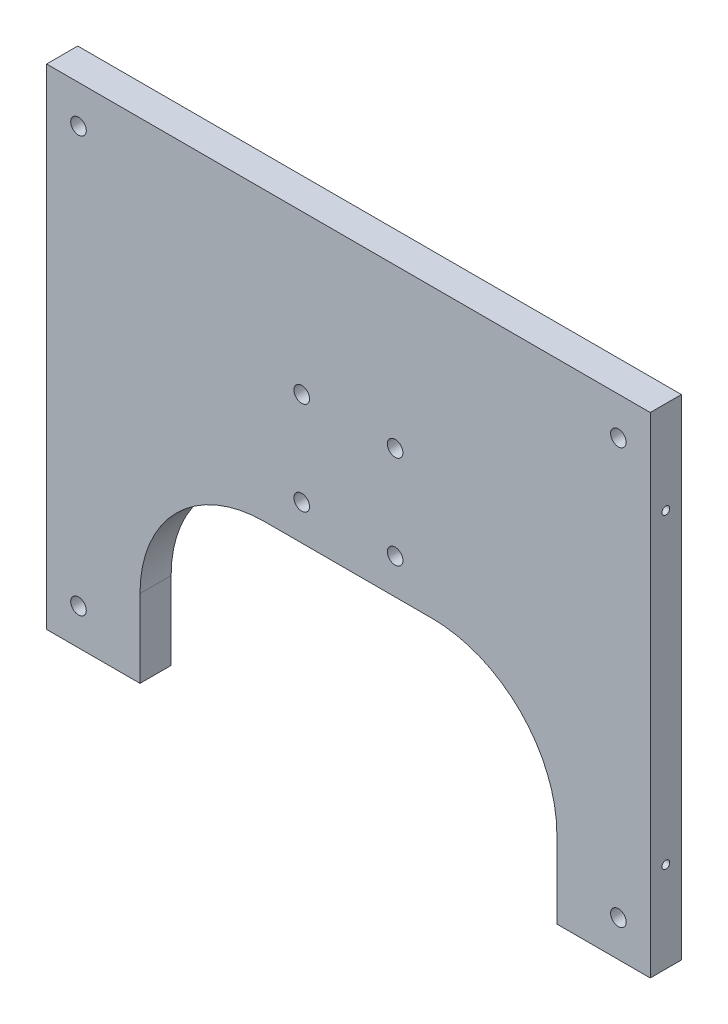
ISO-10303-21;
HEADER;
FILE_DESCRIPTION(('STEP AP214'),'2;1');
FILE_NAME('part.step','',(''),(''),'','','');
FILE_SCHEMA(('AUTOMOTIVE_DESIGN { 1 0 10303 214 1 1 1 1 }'));
ENDSEC;
DATA;
#1=APPLICATION_CONTEXT('core data for automotive mechanical design processes');
#2=APPLICATION_PROTOCOL_DEFINITION('international standard','automotive_design',2000,#1);
#3=PRODUCT_CONTEXT('',#1,'mechanical');
#4=PRODUCT('Part','Part','',(#3));
#5=PRODUCT_RELATED_PRODUCT_CATEGORY('part','',(#4));
#6=PRODUCT_DEFINITION_FORMATION('','',#4);
#7=PRODUCT_DEFINITION_CONTEXT('part definition',#1,'design');
#8=PRODUCT_DEFINITION('design','',#6,#7);
#9=PRODUCT_DEFINITION_SHAPE('','',#8);
#10=(LENGTH_UNIT() NAMED_UNIT(*) SI_UNIT(.MILLI.,.METRE.));
#11=(NAMED_UNIT(*) PLANE_ANGLE_UNIT() SI_UNIT($,.RADIAN.));
#12=(NAMED_UNIT(*) SI_UNIT($,.STERADIAN.) SOLID_ANGLE_UNIT());
#13=UNCERTAINTY_MEASURE_WITH_UNIT(LENGTH_MEASURE(1.E-05),#10,'distance_accuracy_value','');
#14=(GEOMETRIC_REPRESENTATION_CONTEXT(3) GLOBAL_UNCERTAINTY_ASSIGNED_CONTEXT((#13)) GLOBAL_UNIT_ASSIGNED_CONTEXT((#10,
#11,#12)) REPRESENTATION_CONTEXT('',''));
#15=CARTESIAN_POINT('',(0.,0.,0.));
#16=DIRECTION('',(0.,0.,1.));
#17=DIRECTION('',(1.,0.,0.));
#18=AXIS2_PLACEMENT_3D('',#15,#16,#17);
#19=CARTESIAN_POINT('',(12.6999999999998,10.7138543348663,-12.7));
#20=DIRECTION('',(-1.,0.,0.));
#21=DIRECTION('',(0.,-1.,0.));
#22=AXIS2_PLACEMENT_3D('',#19,#20,#21);
#23=PLANE('',#22);
#24=CARTESIAN_POINT('',(12.6999999999998,-152.193459622709,-6.34999999993047));
#25=DIRECTION('',(-1.,0.,0.));
#26=DIRECTION('',(0.,-1.,0.));
#27=AXIS2_PLACEMENT_3D('',#24,#25,#26);
#28=CIRCLE('',#27,1.58749999999999);
#29=CARTESIAN_POINT('',(12.6999999999998,-153.780959622709,-6.34999999993047));
#30=VERTEX_POINT('',#29);
#31=EDGE_CURVE('E178',#30,#30,#28,.T.);
#32=ORIENTED_EDGE('',*,*,#31,.F.);
#33=EDGE_LOOP('',(#32));
#34=FACE_BOUND('',#33,.T.);
#35=CARTESIAN_POINT('',(12.6999999999998,-27.0849452394577,-6.34999999993047));
#36=DIRECTION('',(-1.,0.,0.));
#37=DIRECTION('',(0.,-1.,0.));
#38=AXIS2_PLACEMENT_3D('',#35,#36,#37);
#39=CIRCLE('',#38,1.5875);
#40=CARTESIAN_POINT('',(12.6999999999998,-28.6724452394577,-6.34999999993047));
#41=VERTEX_POINT('',#40);
#42=EDGE_CURVE('E183',#41,#41,#39,.T.);
#43=ORIENTED_EDGE('',*,*,#42,.F.);
#44=EDGE_LOOP('',(#43));
#45=FACE_BOUND('',#44,.T.);
#46=DIRECTION('',(0.,-1.,0.));
#47=VECTOR('',#46,1.);
#48=CARTESIAN_POINT('',(12.6999999999998,10.7138543348663,0.));
#49=LINE('',#48,#47);
#50=CARTESIAN_POINT('',(12.6999999999998,10.7138543348663,0.));
#51=VERTEX_POINT('',#50);
#52=CARTESIAN_POINT('',(12.6999999999998,-189.051843155405,0.));
#53=VERTEX_POINT('',#52);
#54=EDGE_CURVE('E248',#51,#53,#49,.T.);
#55=ORIENTED_EDGE('',*,*,#54,.F.);
#56=DIRECTION('',(0.,0.,1.));
#57=VECTOR('',#56,1.);
#58=CARTESIAN_POINT('',(12.6999999999998,10.7138543348663,-12.7));
#59=LINE('',#58,#57);
#60=CARTESIAN_POINT('',(12.6999999999998,10.7138543348663,-12.7));
#61=VERTEX_POINT('',#60);
#62=EDGE_CURVE('E308',#61,#51,#59,.T.);
#63=ORIENTED_EDGE('',*,*,#62,.F.);
#64=DIRECTION('',(0.,-1.,0.));
#65=VECTOR('',#64,1.);
#66=CARTESIAN_POINT('',(12.6999999999998,10.7138543348663,-12.7));
#67=LINE('',#66,#65);
#68=CARTESIAN_POINT('',(12.6999999999998,-189.051843155405,-12.7));
#69=VERTEX_POINT('',#68);
#70=EDGE_CURVE('E249',#61,#69,#67,.T.);
#71=ORIENTED_EDGE('',*,*,#70,.T.);
#72=DIRECTION('',(0.,0.,1.));
#73=VECTOR('',#72,1.);
#74=CARTESIAN_POINT('',(12.6999999999998,-189.051843155405,-12.7));
#75=LINE('',#74,#73);
#76=EDGE_CURVE('E279',#69,#53,#75,.T.);
#77=ORIENTED_EDGE('',*,*,#76,.T.);
#78=EDGE_LOOP('',(#55,#63,#71,#77));
#79=FACE_BOUND('',#78,.T.);
#80=ADVANCED_FACE('F40',(#34,#45,#79),#23,.T.);
#81=CARTESIAN_POINT('',(258.933482757394,10.7138543348655,-12.7));
#82=DIRECTION('',(0.,1.,0.));
#83=DIRECTION('',(-1.,0.,0.));
#84=AXIS2_PLACEMENT_3D('',#81,#82,#83);
#85=PLANE('',#84);
#86=DIRECTION('',(-1.,0.,0.));
#87=VECTOR('',#86,1.);
#88=CARTESIAN_POINT('',(258.933482757394,10.7138543348655,0.));
#89=LINE('',#88,#87);
#90=CARTESIAN_POINT('',(258.933482757394,10.7138543348655,0.));
#91=VERTEX_POINT('',#90);
#92=EDGE_CURVE('E254',#91,#51,#89,.T.);
#93=ORIENTED_EDGE('',*,*,#92,.F.);
#94=DIRECTION('',(0.,0.,1.));
#95=VECTOR('',#94,1.);
#96=CARTESIAN_POINT('',(258.933482757394,10.7138543348655,-12.7));
#97=LINE('',#96,#95);
#98=CARTESIAN_POINT('',(258.933482757394,10.7138543348655,-12.7));
#99=VERTEX_POINT('',#98);
#100=EDGE_CURVE('E312',#99,#91,#97,.T.);
#101=ORIENTED_EDGE('',*,*,#100,.F.);
#102=DIRECTION('',(-1.,0.,0.));
#103=VECTOR('',#102,1.);
#104=CARTESIAN_POINT('',(258.933482757394,10.7138543348655,-12.7));
#105=LINE('',#104,#103);
#106=EDGE_CURVE('E275',#99,#61,#105,.T.);
#107=ORIENTED_EDGE('',*,*,#106,.T.);
#108=ORIENTED_EDGE('',*,*,#62,.T.);
#109=EDGE_LOOP('',(#93,#101,#107,#108));
#110=FACE_BOUND('',#109,.T.);
#111=ADVANCED_FACE('F361',(#110),#85,.T.);
#112=CARTESIAN_POINT('',(258.933482757394,10.7138543348655,-12.7));
#113=DIRECTION('',(1.,0.,0.));
#114=DIRECTION('',(0.,1.,0.));
#115=AXIS2_PLACEMENT_3D('',#112,#113,#114);
#116=PLANE('',#115);
#117=CARTESIAN_POINT('',(258.933482757393,-152.19345962271,-6.34999999993047));
#118=DIRECTION('',(1.,0.,0.));
#119=DIRECTION('',(0.,1.,0.));
#120=AXIS2_PLACEMENT_3D('',#117,#118,#119);
#121=CIRCLE('',#120,1.58749999999999);
#122=CARTESIAN_POINT('',(258.933482757393,-150.60595962271,-6.34999999993047));
#123=VERTEX_POINT('',#122);
#124=EDGE_CURVE('E44',#123,#123,#121,.T.);
#125=ORIENTED_EDGE('',*,*,#124,.F.);
#126=EDGE_LOOP('',(#125));
#127=FACE_BOUND('',#126,.T.);
#128=CARTESIAN_POINT('',(258.933482757394,-27.0849452394586,-6.34999999993047));
#129=DIRECTION('',(1.,0.,0.));
#130=DIRECTION('',(0.,1.,0.));
#131=AXIS2_PLACEMENT_3D('',#128,#129,#130);
#132=CIRCLE('',#131,1.5875);
#133=CARTESIAN_POINT('',(258.933482757394,-25.4974452394586,-6.34999999993047));
#134=VERTEX_POINT('',#133);
#135=EDGE_CURVE('E173',#134,#134,#132,.T.);
#136=ORIENTED_EDGE('',*,*,#135,.F.);
#137=EDGE_LOOP('',(#136));
#138=FACE_BOUND('',#137,.T.);
#139=DIRECTION('',(0.,1.,0.));
#140=VECTOR('',#139,1.);
#141=CARTESIAN_POINT('',(258.933482757394,10.7138543348655,0.));
#142=LINE('',#141,#140);
#143=CARTESIAN_POINT('',(258.933482757393,-189.051843155405,0.));
#144=VERTEX_POINT('',#143);
#145=EDGE_CURVE('E301',#144,#91,#142,.T.);
#146=ORIENTED_EDGE('',*,*,#145,.F.);
#147=DIRECTION('',(0.,0.,1.));
#148=VECTOR('',#147,1.);
#149=CARTESIAN_POINT('',(258.933482757393,-189.051843155405,-12.7));
#150=LINE('',#149,#148);
#151=CARTESIAN_POINT('',(258.933482757393,-189.051843155405,-12.7));
#152=VERTEX_POINT('',#151);
#153=EDGE_CURVE('E315',#152,#144,#150,.T.);
#154=ORIENTED_EDGE('',*,*,#153,.F.);
#155=DIRECTION('',(0.,1.,0.));
#156=VECTOR('',#155,1.);
#157=CARTESIAN_POINT('',(258.933482757394,10.7138543348655,-12.7));
#158=LINE('',#157,#156);
#159=EDGE_CURVE('E271',#152,#99,#158,.T.);
#160=ORIENTED_EDGE('',*,*,#159,.T.);
#161=ORIENTED_EDGE('',*,*,#100,.T.);
#162=EDGE_LOOP('',(#146,#154,#160,#161));
#163=FACE_BOUND('',#162,.T.);
#164=ADVANCED_FACE('F357',(#127,#138,#163),#116,.T.);
#165=CARTESIAN_POINT('',(258.933482757393,-189.051843155405,-12.7));
#166=DIRECTION('',(0.,-1.,0.));
#167=DIRECTION('',(1.,0.,0.));
#168=AXIS2_PLACEMENT_3D('',#165,#166,#167);
#169=PLANE('',#168);
#170=DIRECTION('',(1.,0.,0.));
#171=VECTOR('',#170,1.);
#172=CARTESIAN_POINT('',(258.933482757393,-189.051843155405,0.));
#173=LINE('',#172,#171);
#174=CARTESIAN_POINT('',(220.833482757393,-189.051843155405,0.));
#175=VERTEX_POINT('',#174);
#176=EDGE_CURVE('E297',#175,#144,#173,.T.);
#177=ORIENTED_EDGE('',*,*,#176,.F.);
#178=DIRECTION('',(0.,0.,1.));
#179=VECTOR('',#178,1.);
#180=CARTESIAN_POINT('',(220.833482757393,-189.051843155405,-12.7));
#181=LINE('',#180,#179);
#182=CARTESIAN_POINT('',(220.833482757393,-189.051843155405,-12.7));
#183=VERTEX_POINT('',#182);
#184=EDGE_CURVE('E317',#183,#175,#181,.T.);
#185=ORIENTED_EDGE('',*,*,#184,.F.);
#186=DIRECTION('',(1.,0.,0.));
#187=VECTOR('',#186,1.);
#188=CARTESIAN_POINT('',(258.933482757393,-189.051843155405,-12.7));
#189=LINE('',#188,#187);
#190=EDGE_CURVE('E267',#183,#152,#189,.T.);
#191=ORIENTED_EDGE('',*,*,#190,.T.);
#192=ORIENTED_EDGE('',*,*,#153,.T.);
#193=EDGE_LOOP('',(#177,#185,#191,#192));
#194=FACE_BOUND('',#193,.T.);
#195=ADVANCED_FACE('F360',(#194),#169,.T.);
#196=CARTESIAN_POINT('',(220.833482757393,-189.051843155405,-12.7));
#197=DIRECTION('',(-1.,0.,0.));
#198=DIRECTION('',(0.,-1.,0.));
#199=AXIS2_PLACEMENT_3D('',#196,#197,#198);
#200=PLANE('',#199);
#201=DIRECTION('',(0.,-1.,0.));
#202=VECTOR('',#201,1.);
#203=CARTESIAN_POINT('',(220.833482757393,-189.051843155405,0.));
#204=LINE('',#203,#202);
#205=CARTESIAN_POINT('',(220.833482757393,-157.301843155405,0.));
#206=VERTEX_POINT('',#205);
#207=EDGE_CURVE('E295',#206,#175,#204,.T.);
#208=ORIENTED_EDGE('',*,*,#207,.F.);
#209=DIRECTION('',(0.,0.,1.));
#210=VECTOR('',#209,1.);
#211=CARTESIAN_POINT('',(220.833482757393,-157.301843155405,-12.7));
#212=LINE('',#211,#210);
#213=CARTESIAN_POINT('',(220.833482757393,-157.301843155405,-12.7));
#214=VERTEX_POINT('',#213);
#215=EDGE_CURVE('E332',#206,#214,#212,.F.);
#216=ORIENTED_EDGE('',*,*,#215,.T.);
#217=DIRECTION('',(0.,-1.,0.));
#218=VECTOR('',#217,1.);
#219=CARTESIAN_POINT('',(220.833482757393,-189.051843155405,-12.7));
#220=LINE('',#219,#218);
#221=EDGE_CURVE('E265',#214,#183,#220,.T.);
#222=ORIENTED_EDGE('',*,*,#221,.T.);
#223=ORIENTED_EDGE('',*,*,#184,.T.);
#224=EDGE_LOOP('',(#208,#216,#222,#223));
#225=FACE_BOUND('',#224,.T.);
#226=ADVANCED_FACE('F422',(#225),#200,.T.);
#227=CARTESIAN_POINT('',(50.7999999999998,-106.501843155405,-12.7));
#228=DIRECTION('',(0.,-1.,0.));
#229=DIRECTION('',(1.,0.,0.));
#230=AXIS2_PLACEMENT_3D('',#227,#228,#229);
#231=PLANE('',#230);
#232=DIRECTION('',(1.,0.,0.));
#233=VECTOR('',#232,1.);
#234=CARTESIAN_POINT('',(50.7999999999998,-106.501843155405,-12.7));
#235=LINE('',#234,#233);
#236=CARTESIAN_POINT('',(101.6,-106.501843155405,-12.7));
#237=VERTEX_POINT('',#236);
#238=CARTESIAN_POINT('',(170.033482757393,-106.501843155405,-12.7));
#239=VERTEX_POINT('',#238);
#240=EDGE_CURVE('E261',#237,#239,#235,.T.);
#241=ORIENTED_EDGE('',*,*,#240,.T.);
#242=DIRECTION('',(0.,0.,1.));
#243=VECTOR('',#242,1.);
#244=CARTESIAN_POINT('',(170.033482757394,-106.501843155405,0.));
#245=LINE('',#244,#243);
#246=CARTESIAN_POINT('',(170.033482757393,-106.501843155405,0.));
#247=VERTEX_POINT('',#246);
#248=EDGE_CURVE('E328',#239,#247,#245,.T.);
#249=ORIENTED_EDGE('',*,*,#248,.T.);
#250=DIRECTION('',(1.,0.,0.));
#251=VECTOR('',#250,1.);
#252=CARTESIAN_POINT('',(50.7999999999998,-106.501843155405,0.));
#253=LINE('',#252,#251);
#254=CARTESIAN_POINT('',(101.6,-106.501843155405,0.));
#255=VERTEX_POINT('',#254);
#256=EDGE_CURVE('E291',#255,#247,#253,.T.);
#257=ORIENTED_EDGE('',*,*,#256,.F.);
#258=DIRECTION('',(0.,0.,1.));
#259=VECTOR('',#258,1.);
#260=CARTESIAN_POINT('',(101.6,-106.501843155405,-12.7));
#261=LINE('',#260,#259);
#262=EDGE_CURVE('E311',#255,#237,#261,.F.);
#263=ORIENTED_EDGE('',*,*,#262,.T.);
#264=EDGE_LOOP('',(#241,#249,#257,#263));
#265=FACE_BOUND('',#264,.T.);
#266=ADVANCED_FACE('F391',(#265),#231,.T.);
#267=CARTESIAN_POINT('',(50.7999999999998,-189.051843155405,-12.7));
#268=DIRECTION('',(1.,0.,0.));
#269=DIRECTION('',(0.,0.,-1.));
#270=AXIS2_PLACEMENT_3D('',#267,#268,#269);
#271=PLANE('',#270);
#272=DIRECTION('',(0.,1.,0.));
#273=VECTOR('',#272,1.);
#274=CARTESIAN_POINT('',(50.7999999999998,-189.051843155405,-12.7));
#275=LINE('',#274,#273);
#276=CARTESIAN_POINT('',(50.7999999999998,-189.051843155405,-12.7));
#277=VERTEX_POINT('',#276);
#278=CARTESIAN_POINT('',(50.7999999999998,-157.301843155405,-12.7));
#279=VERTEX_POINT('',#278);
#280=EDGE_CURVE('E258',#277,#279,#275,.T.);
#281=ORIENTED_EDGE('',*,*,#280,.T.);
#282=DIRECTION('',(0.,0.,1.));
#283=VECTOR('',#282,1.);
#284=CARTESIAN_POINT('',(50.7999999999998,-157.301843155405,0.));
#285=LINE('',#284,#283);
#286=CARTESIAN_POINT('',(50.7999999999998,-157.301843155405,0.));
#287=VERTEX_POINT('',#286);
#288=EDGE_CURVE('E335',#279,#287,#285,.T.);
#289=ORIENTED_EDGE('',*,*,#288,.T.);
#290=DIRECTION('',(0.,1.,0.));
#291=VECTOR('',#290,1.);
#292=CARTESIAN_POINT('',(50.7999999999998,-189.051843155405,0.));
#293=LINE('',#292,#291);
#294=CARTESIAN_POINT('',(50.7999999999998,-189.051843155405,0.));
#295=VERTEX_POINT('',#294);
#296=EDGE_CURVE('E287',#295,#287,#293,.T.);
#297=ORIENTED_EDGE('',*,*,#296,.F.);
#298=DIRECTION('',(0.,0.,1.));
#299=VECTOR('',#298,1.);
#300=CARTESIAN_POINT('',(50.7999999999998,-189.051843155405,-12.7));
#301=LINE('',#300,#299);
#302=EDGE_CURVE('E321',#277,#295,#301,.T.);
#303=ORIENTED_EDGE('',*,*,#302,.F.);
#304=EDGE_LOOP('',(#281,#289,#297,#303));
#305=FACE_BOUND('',#304,.T.);
#306=ADVANCED_FACE('F388',(#305),#271,.T.);
#307=CARTESIAN_POINT('',(12.6999999999998,-189.051843155405,-12.7));
#308=DIRECTION('',(0.,-1.,0.));
#309=DIRECTION('',(0.,0.,-1.));
#310=AXIS2_PLACEMENT_3D('',#307,#308,#309);
#311=PLANE('',#310);
#312=DIRECTION('',(1.,0.,0.));
#313=VECTOR('',#312,1.);
#314=CARTESIAN_POINT('',(12.6999999999998,-189.051843155405,0.));
#315=LINE('',#314,#313);
#316=EDGE_CURVE('E283',#53,#295,#315,.T.);
#317=ORIENTED_EDGE('',*,*,#316,.F.);
#318=ORIENTED_EDGE('',*,*,#76,.F.);
#319=DIRECTION('',(1.,0.,0.));
#320=VECTOR('',#319,1.);
#321=CARTESIAN_POINT('',(12.6999999999998,-189.051843155405,-12.7));
#322=LINE('',#321,#320);
#323=EDGE_CURVE('E253',#69,#277,#322,.T.);
#324=ORIENTED_EDGE('',*,*,#323,.T.);
#325=ORIENTED_EDGE('',*,*,#302,.T.);
#326=EDGE_LOOP('',(#317,#318,#324,#325));
#327=FACE_BOUND('',#326,.T.);
#328=ADVANCED_FACE('F385',(#327),#311,.T.);
#329=CARTESIAN_POINT('',(0.,0.,-12.7));
#330=DIRECTION('',(0.,0.,1.));
#331=DIRECTION('',(1.,0.,0.));
#332=AXIS2_PLACEMENT_3D('',#329,#330,#331);
#333=PLANE('',#332);
#334=CARTESIAN_POINT('',(25.7061628891201,-174.233423282267,-12.7));
#335=DIRECTION('',(0.,0.,-1.));
#336=DIRECTION('',(-1.,0.,0.));
#337=AXIS2_PLACEMENT_3D('',#334,#335,#336);
#338=CIRCLE('',#337,3.175);
#339=CARTESIAN_POINT('',(22.5311628891201,-174.233423282267,-12.7));
#340=VERTEX_POINT('',#339);
#341=EDGE_CURVE('E184',#340,#340,#338,.T.);
#342=ORIENTED_EDGE('',*,*,#341,.F.);
#343=EDGE_LOOP('',(#342));
#344=FACE_BOUND('',#343,.T.);
#345=CARTESIAN_POINT('',(116.766741378697,-92.064314728551,-12.7));
#346=DIRECTION('',(0.,0.,-1.));
#347=DIRECTION('',(-1.,0.,0.));
#348=AXIS2_PLACEMENT_3D('',#345,#346,#347);
#349=CIRCLE('',#348,3.175);
#350=CARTESIAN_POINT('',(113.591741378697,-92.064314728551,-12.7));
#351=VERTEX_POINT('',#350);
#352=EDGE_CURVE('E192',#351,#351,#349,.T.);
#353=ORIENTED_EDGE('',*,*,#352,.F.);
#354=EDGE_LOOP('',(#353));
#355=FACE_BOUND('',#354,.T.);
#356=CARTESIAN_POINT('',(154.866741378697,-92.0643147285511,-12.7));
#357=DIRECTION('',(0.,0.,-1.));
#358=DIRECTION('',(-1.,0.,0.));
#359=AXIS2_PLACEMENT_3D('',#356,#357,#358);
#360=CIRCLE('',#359,3.17500000000001);
#361=CARTESIAN_POINT('',(151.691741378697,-92.0643147285511,-12.7));
#362=VERTEX_POINT('',#361);
#363=EDGE_CURVE('E200',#362,#362,#360,.T.);
#364=ORIENTED_EDGE('',*,*,#363,.F.);
#365=EDGE_LOOP('',(#364));
#366=FACE_BOUND('',#365,.T.);
#367=CARTESIAN_POINT('',(245.927319868274,-174.233423282268,-12.7));
#368=DIRECTION('',(0.,0.,-1.));
#369=DIRECTION('',(-1.,0.,0.));
#370=AXIS2_PLACEMENT_3D('',#367,#368,#369);
#371=CIRCLE('',#370,3.17500000000001);
#372=CARTESIAN_POINT('',(242.752319868274,-174.233423282268,-12.7));
#373=VERTEX_POINT('',#372);
#374=EDGE_CURVE('E208',#373,#373,#371,.T.);
#375=ORIENTED_EDGE('',*,*,#374,.F.);
#376=EDGE_LOOP('',(#375));
#377=FACE_BOUND('',#376,.T.);
#378=CARTESIAN_POINT('',(154.866741378697,-53.9643147285511,-12.7));
#379=DIRECTION('',(0.,0.,-1.));
#380=DIRECTION('',(-1.,0.,0.));
#381=AXIS2_PLACEMENT_3D('',#378,#379,#380);
#382=CIRCLE('',#381,3.17500000000001);
#383=CARTESIAN_POINT('',(151.691741378697,-53.9643147285511,-12.7));
#384=VERTEX_POINT('',#383);
#385=EDGE_CURVE('E216',#384,#384,#382,.T.);
#386=ORIENTED_EDGE('',*,*,#385,.F.);
#387=EDGE_LOOP('',(#386));
#388=FACE_BOUND('',#387,.T.);
#389=CARTESIAN_POINT('',(245.927319868274,-4.74797050600834,-12.7));
#390=DIRECTION('',(0.,0.,-1.));
#391=DIRECTION('',(-1.,0.,0.));
#392=AXIS2_PLACEMENT_3D('',#389,#390,#391);
#393=CIRCLE('',#392,3.17500000000001);
#394=CARTESIAN_POINT('',(242.752319868274,-4.74797050600834,-12.7));
#395=VERTEX_POINT('',#394);
#396=EDGE_CURVE('E224',#395,#395,#393,.T.);
#397=ORIENTED_EDGE('',*,*,#396,.F.);
#398=EDGE_LOOP('',(#397));
#399=FACE_BOUND('',#398,.T.);
#400=CARTESIAN_POINT('',(116.766741378697,-53.964314728551,-12.7));
#401=DIRECTION('',(0.,0.,-1.));
#402=DIRECTION('',(-1.,0.,0.));
#403=AXIS2_PLACEMENT_3D('',#400,#401,#402);
#404=CIRCLE('',#403,3.175);
#405=CARTESIAN_POINT('',(113.591741378697,-53.964314728551,-12.7));
#406=VERTEX_POINT('',#405);
#407=EDGE_CURVE('E232',#406,#406,#404,.T.);
#408=ORIENTED_EDGE('',*,*,#407,.F.);
#409=EDGE_LOOP('',(#408));
#410=FACE_BOUND('',#409,.T.);
#411=CARTESIAN_POINT('',(25.7061628891206,-4.7479705060077,-12.7));
#412=DIRECTION('',(0.,0.,-1.));
#413=DIRECTION('',(-1.,0.,0.));
#414=AXIS2_PLACEMENT_3D('',#411,#412,#413);
#415=CIRCLE('',#414,3.175);
#416=CARTESIAN_POINT('',(22.5311628891206,-4.7479705060077,-12.7));
#417=VERTEX_POINT('',#416);
#418=EDGE_CURVE('E240',#417,#417,#415,.T.);
#419=ORIENTED_EDGE('',*,*,#418,.F.);
#420=EDGE_LOOP('',(#419));
#421=FACE_BOUND('',#420,.T.);
#422=ORIENTED_EDGE('',*,*,#70,.F.);
#423=ORIENTED_EDGE('',*,*,#106,.F.);
#424=ORIENTED_EDGE('',*,*,#159,.F.);
#425=ORIENTED_EDGE('',*,*,#190,.F.);
#426=ORIENTED_EDGE('',*,*,#221,.F.);
#427=CARTESIAN_POINT('',(170.033482757393,-157.301843155405,-12.7));
#428=DIRECTION('',(0.,0.,1.));
#429=DIRECTION('',(1.,0.,0.));
#430=AXIS2_PLACEMENT_3D('',#427,#428,#429);
#431=CIRCLE('',#430,50.8);
#432=EDGE_CURVE('E341',#214,#239,#431,.T.);
#433=ORIENTED_EDGE('',*,*,#432,.T.);
#434=ORIENTED_EDGE('',*,*,#240,.F.);
#435=CARTESIAN_POINT('',(101.6,-157.301843155405,-12.7));
#436=DIRECTION('',(0.,0.,1.));
#437=DIRECTION('',(1.,0.,0.));
#438=AXIS2_PLACEMENT_3D('',#435,#436,#437);
#439=CIRCLE('',#438,50.8);
#440=EDGE_CURVE('E11',#237,#279,#439,.T.);
#441=ORIENTED_EDGE('',*,*,#440,.T.);
#442=ORIENTED_EDGE('',*,*,#280,.F.);
#443=ORIENTED_EDGE('',*,*,#323,.F.);
#444=EDGE_LOOP('',(#422,#423,#424,#425,#426,#433,#434,#441,#442,#443));
#445=FACE_BOUND('',#444,.T.);
#446=ADVANCED_FACE('F376',(#344,#355,#366,#377,#388,#399,#410,#421,#445),#333,.F.);
#447=CARTESIAN_POINT('',(0.,0.,0.));
#448=DIRECTION('',(0.,0.,1.));
#449=DIRECTION('',(1.,0.,0.));
#450=AXIS2_PLACEMENT_3D('',#447,#448,#449);
#451=PLANE('',#450);
#452=CARTESIAN_POINT('',(25.7061628891201,-174.233423282267,0.));
#453=DIRECTION('',(0.,0.,-1.));
#454=DIRECTION('',(-1.,0.,0.));
#455=AXIS2_PLACEMENT_3D('',#452,#453,#454);
#456=CIRCLE('',#455,3.175);
#457=CARTESIAN_POINT('',(22.5311628891201,-174.233423282267,0.));
#458=VERTEX_POINT('',#457);
#459=EDGE_CURVE('E188',#458,#458,#456,.T.);
#460=ORIENTED_EDGE('',*,*,#459,.T.);
#461=EDGE_LOOP('',(#460));
#462=FACE_BOUND('',#461,.T.);
#463=CARTESIAN_POINT('',(116.766741378697,-92.064314728551,0.));
#464=DIRECTION('',(0.,0.,-1.));
#465=DIRECTION('',(-1.,0.,0.));
#466=AXIS2_PLACEMENT_3D('',#463,#464,#465);
#467=CIRCLE('',#466,3.175);
#468=CARTESIAN_POINT('',(113.591741378697,-92.064314728551,0.));
#469=VERTEX_POINT('',#468);
#470=EDGE_CURVE('E196',#469,#469,#467,.T.);
#471=ORIENTED_EDGE('',*,*,#470,.T.);
#472=EDGE_LOOP('',(#471));
#473=FACE_BOUND('',#472,.T.);
#474=CARTESIAN_POINT('',(154.866741378697,-92.0643147285511,0.));
#475=DIRECTION('',(0.,0.,-1.));
#476=DIRECTION('',(-1.,0.,0.));
#477=AXIS2_PLACEMENT_3D('',#474,#475,#476);
#478=CIRCLE('',#477,3.17499999999998);
#479=CARTESIAN_POINT('',(151.691741378697,-92.0643147285511,0.));
#480=VERTEX_POINT('',#479);
#481=EDGE_CURVE('E204',#480,#480,#478,.T.);
#482=ORIENTED_EDGE('',*,*,#481,.T.);
#483=EDGE_LOOP('',(#482));
#484=FACE_BOUND('',#483,.T.);
#485=CARTESIAN_POINT('',(245.927319868274,-174.233423282268,0.));
#486=DIRECTION('',(0.,0.,-1.));
#487=DIRECTION('',(-1.,0.,0.));
#488=AXIS2_PLACEMENT_3D('',#485,#486,#487);
#489=CIRCLE('',#488,3.17499999999998);
#490=CARTESIAN_POINT('',(242.752319868274,-174.233423282268,0.));
#491=VERTEX_POINT('',#490);
#492=EDGE_CURVE('E212',#491,#491,#489,.T.);
#493=ORIENTED_EDGE('',*,*,#492,.T.);
#494=EDGE_LOOP('',(#493));
#495=FACE_BOUND('',#494,.T.);
#496=CARTESIAN_POINT('',(154.866741378697,-53.9643147285511,0.));
#497=DIRECTION('',(0.,0.,-1.));
#498=DIRECTION('',(-1.,0.,0.));
#499=AXIS2_PLACEMENT_3D('',#496,#497,#498);
#500=CIRCLE('',#499,3.17499999999998);
#501=CARTESIAN_POINT('',(151.691741378697,-53.9643147285511,0.));
#502=VERTEX_POINT('',#501);
#503=EDGE_CURVE('E220',#502,#502,#500,.T.);
#504=ORIENTED_EDGE('',*,*,#503,.T.);
#505=EDGE_LOOP('',(#504));
#506=FACE_BOUND('',#505,.T.);
#507=CARTESIAN_POINT('',(245.927319868274,-4.74797050600834,0.));
#508=DIRECTION('',(0.,0.,-1.));
#509=DIRECTION('',(-1.,0.,0.));
#510=AXIS2_PLACEMENT_3D('',#507,#508,#509);
#511=CIRCLE('',#510,3.17499999999998);
#512=CARTESIAN_POINT('',(242.752319868274,-4.74797050600834,0.));
#513=VERTEX_POINT('',#512);
#514=EDGE_CURVE('E228',#513,#513,#511,.T.);
#515=ORIENTED_EDGE('',*,*,#514,.T.);
#516=EDGE_LOOP('',(#515));
#517=FACE_BOUND('',#516,.T.);
#518=CARTESIAN_POINT('',(116.766741378697,-53.964314728551,0.));
#519=DIRECTION('',(0.,0.,-1.));
#520=DIRECTION('',(-1.,0.,0.));
#521=AXIS2_PLACEMENT_3D('',#518,#519,#520);
#522=CIRCLE('',#521,3.175);
#523=CARTESIAN_POINT('',(113.591741378697,-53.964314728551,0.));
#524=VERTEX_POINT('',#523);
#525=EDGE_CURVE('E236',#524,#524,#522,.T.);
#526=ORIENTED_EDGE('',*,*,#525,.T.);
#527=EDGE_LOOP('',(#526));
#528=FACE_BOUND('',#527,.T.);
#529=CARTESIAN_POINT('',(25.7061628891206,-4.7479705060077,0.));
#530=DIRECTION('',(0.,0.,-1.));
#531=DIRECTION('',(-1.,0.,0.));
#532=AXIS2_PLACEMENT_3D('',#529,#530,#531);
#533=CIRCLE('',#532,3.175);
#534=CARTESIAN_POINT('',(22.5311628891206,-4.7479705060077,0.));
#535=VERTEX_POINT('',#534);
#536=EDGE_CURVE('E244',#535,#535,#533,.T.);
#537=ORIENTED_EDGE('',*,*,#536,.T.);
#538=EDGE_LOOP('',(#537));
#539=FACE_BOUND('',#538,.T.);
#540=ORIENTED_EDGE('',*,*,#54,.T.);
#541=ORIENTED_EDGE('',*,*,#316,.T.);
#542=ORIENTED_EDGE('',*,*,#296,.T.);
#543=CARTESIAN_POINT('',(101.6,-157.301843155405,0.));
#544=DIRECTION('',(0.,0.,1.));
#545=DIRECTION('',(1.,0.,0.));
#546=AXIS2_PLACEMENT_3D('',#543,#544,#545);
#547=CIRCLE('',#546,50.8);
#548=EDGE_CURVE('E50',#287,#255,#547,.F.);
#549=ORIENTED_EDGE('',*,*,#548,.T.);
#550=ORIENTED_EDGE('',*,*,#256,.T.);
#551=CARTESIAN_POINT('',(170.033482757393,-157.301843155405,0.));
#552=DIRECTION('',(0.,0.,1.));
#553=DIRECTION('',(1.,0.,0.));
#554=AXIS2_PLACEMENT_3D('',#551,#552,#553);
#555=CIRCLE('',#554,50.8);
#556=EDGE_CURVE('E338',#247,#206,#555,.F.);
#557=ORIENTED_EDGE('',*,*,#556,.T.);
#558=ORIENTED_EDGE('',*,*,#207,.T.);
#559=ORIENTED_EDGE('',*,*,#176,.T.);
#560=ORIENTED_EDGE('',*,*,#145,.T.);
#561=ORIENTED_EDGE('',*,*,#92,.T.);
#562=EDGE_LOOP('',(#540,#541,#542,#549,#550,#557,#558,#559,#560,#561));
#563=FACE_BOUND('',#562,.T.);
#564=ADVANCED_FACE('F369',(#462,#473,#484,#495,#506,#517,#528,#539,#563),#451,.T.);
#565=CARTESIAN_POINT('',(25.7061628891206,-4.7479705060077,-12.7));
#566=DIRECTION('',(0.,0.,-1.));
#567=DIRECTION('',(-1.,0.,0.));
#568=AXIS2_PLACEMENT_3D('',#565,#566,#567);
#569=CYLINDRICAL_SURFACE('',#568,3.175);
#570=ORIENTED_EDGE('',*,*,#536,.F.);
#571=EDGE_LOOP('',(#570));
#572=FACE_BOUND('',#571,.T.);
#573=ORIENTED_EDGE('',*,*,#418,.T.);
#574=EDGE_LOOP('',(#573));
#575=FACE_BOUND('',#574,.T.);
#576=ADVANCED_FACE('F430',(#572,#575),#569,.F.);
#577=CARTESIAN_POINT('',(116.766741378697,-53.964314728551,-12.7));
#578=DIRECTION('',(0.,0.,-1.));
#579=DIRECTION('',(-1.,0.,0.));
#580=AXIS2_PLACEMENT_3D('',#577,#578,#579);
#581=CYLINDRICAL_SURFACE('',#580,3.175);
#582=ORIENTED_EDGE('',*,*,#525,.F.);
#583=EDGE_LOOP('',(#582));
#584=FACE_BOUND('',#583,.T.);
#585=ORIENTED_EDGE('',*,*,#407,.T.);
#586=EDGE_LOOP('',(#585));
#587=FACE_BOUND('',#586,.T.);
#588=ADVANCED_FACE('F437',(#584,#587),#581,.F.);
#589=CARTESIAN_POINT('',(245.927319868274,-4.74797050600834,-12.7));
#590=DIRECTION('',(0.,0.,-1.));
#591=DIRECTION('',(-1.,0.,0.));
#592=AXIS2_PLACEMENT_3D('',#589,#590,#591);
#593=CYLINDRICAL_SURFACE('',#592,3.175);
#594=ORIENTED_EDGE('',*,*,#514,.F.);
#595=EDGE_LOOP('',(#594));
#596=FACE_BOUND('',#595,.T.);
#597=ORIENTED_EDGE('',*,*,#396,.T.);
#598=EDGE_LOOP('',(#597));
#599=FACE_BOUND('',#598,.T.);
#600=ADVANCED_FACE('F440',(#596,#599),#593,.F.);
#601=CARTESIAN_POINT('',(154.866741378697,-53.9643147285511,-12.7));
#602=DIRECTION('',(0.,0.,-1.));
#603=DIRECTION('',(-1.,0.,0.));
#604=AXIS2_PLACEMENT_3D('',#601,#602,#603);
#605=CYLINDRICAL_SURFACE('',#604,3.175);
#606=ORIENTED_EDGE('',*,*,#503,.F.);
#607=EDGE_LOOP('',(#606));
#608=FACE_BOUND('',#607,.T.);
#609=ORIENTED_EDGE('',*,*,#385,.T.);
#610=EDGE_LOOP('',(#609));
#611=FACE_BOUND('',#610,.T.);
#612=ADVANCED_FACE('F444',(#608,#611),#605,.F.);
#613=CARTESIAN_POINT('',(245.927319868274,-174.233423282268,-12.7));
#614=DIRECTION('',(0.,0.,-1.));
#615=DIRECTION('',(-1.,0.,0.));
#616=AXIS2_PLACEMENT_3D('',#613,#614,#615);
#617=CYLINDRICAL_SURFACE('',#616,3.175);
#618=ORIENTED_EDGE('',*,*,#492,.F.);
#619=EDGE_LOOP('',(#618));
#620=FACE_BOUND('',#619,.T.);
#621=ORIENTED_EDGE('',*,*,#374,.T.);
#622=EDGE_LOOP('',(#621));
#623=FACE_BOUND('',#622,.T.);
#624=ADVANCED_FACE('F448',(#620,#623),#617,.F.);
#625=CARTESIAN_POINT('',(154.866741378697,-92.0643147285511,-12.7));
#626=DIRECTION('',(0.,0.,-1.));
#627=DIRECTION('',(-1.,0.,0.));
#628=AXIS2_PLACEMENT_3D('',#625,#626,#627);
#629=CYLINDRICAL_SURFACE('',#628,3.175);
#630=ORIENTED_EDGE('',*,*,#481,.F.);
#631=EDGE_LOOP('',(#630));
#632=FACE_BOUND('',#631,.T.);
#633=ORIENTED_EDGE('',*,*,#363,.T.);
#634=EDGE_LOOP('',(#633));
#635=FACE_BOUND('',#634,.T.);
#636=ADVANCED_FACE('F452',(#632,#635),#629,.F.);
#637=CARTESIAN_POINT('',(116.766741378697,-92.064314728551,-12.7));
#638=DIRECTION('',(0.,0.,-1.));
#639=DIRECTION('',(-1.,0.,0.));
#640=AXIS2_PLACEMENT_3D('',#637,#638,#639);
#641=CYLINDRICAL_SURFACE('',#640,3.175);
#642=ORIENTED_EDGE('',*,*,#470,.F.);
#643=EDGE_LOOP('',(#642));
#644=FACE_BOUND('',#643,.T.);
#645=ORIENTED_EDGE('',*,*,#352,.T.);
#646=EDGE_LOOP('',(#645));
#647=FACE_BOUND('',#646,.T.);
#648=ADVANCED_FACE('F456',(#644,#647),#641,.F.);
#649=CARTESIAN_POINT('',(25.7061628891201,-174.233423282267,-12.7));
#650=DIRECTION('',(0.,0.,-1.));
#651=DIRECTION('',(-1.,0.,0.));
#652=AXIS2_PLACEMENT_3D('',#649,#650,#651);
#653=CYLINDRICAL_SURFACE('',#652,3.175);
#654=ORIENTED_EDGE('',*,*,#459,.F.);
#655=EDGE_LOOP('',(#654));
#656=FACE_BOUND('',#655,.T.);
#657=ORIENTED_EDGE('',*,*,#341,.T.);
#658=EDGE_LOOP('',(#657));
#659=FACE_BOUND('',#658,.T.);
#660=ADVANCED_FACE('F404',(#656,#659),#653,.F.);
#661=CARTESIAN_POINT('',(170.033482757393,-157.301843155405,-12.7));
#662=DIRECTION('',(0.,0.,-1.));
#663=DIRECTION('',(-1.,0.,0.));
#664=AXIS2_PLACEMENT_3D('',#661,#662,#663);
#665=CYLINDRICAL_SURFACE('',#664,50.8);
#666=ORIENTED_EDGE('',*,*,#432,.F.);
#667=ORIENTED_EDGE('',*,*,#215,.F.);
#668=ORIENTED_EDGE('',*,*,#556,.F.);
#669=ORIENTED_EDGE('',*,*,#248,.F.);
#670=EDGE_LOOP('',(#666,#667,#668,#669));
#671=FACE_BOUND('',#670,.T.);
#672=ADVANCED_FACE('F395',(#671),#665,.F.);
#673=CARTESIAN_POINT('',(101.6,-157.301843155405,-12.7));
#674=DIRECTION('',(0.,0.,-1.));
#675=DIRECTION('',(-1.,0.,0.));
#676=AXIS2_PLACEMENT_3D('',#673,#674,#675);
#677=CYLINDRICAL_SURFACE('',#676,50.8);
#678=ORIENTED_EDGE('',*,*,#440,.F.);
#679=ORIENTED_EDGE('',*,*,#262,.F.);
#680=ORIENTED_EDGE('',*,*,#548,.F.);
#681=ORIENTED_EDGE('',*,*,#288,.F.);
#682=EDGE_LOOP('',(#678,#679,#680,#681));
#683=FACE_BOUND('',#682,.T.);
#684=ADVANCED_FACE('F42',(#683),#677,.F.);
#685=CARTESIAN_POINT('',(38.0999999999961,-27.0849452394577,-6.34999999993047));
#686=DIRECTION('',(-1.,0.,0.));
#687=DIRECTION('',(0.,0.,1.));
#688=AXIS2_PLACEMENT_3D('',#685,#686,#687);
#689=CONICAL_SURFACE('',#688,1.5875,1.02974425867666);
#690=CARTESIAN_POINT('',(39.0538662327024,-27.0849452394577,-6.34999999993047));
#691=VERTEX_POINT('',#690);
#692=VERTEX_LOOP('',#691);
#693=FACE_BOUND('',#692,.T.);
#694=CARTESIAN_POINT('',(38.0999999999961,-27.0849452394577,-6.34999999993047));
#695=DIRECTION('',(-1.,0.,0.));
#696=DIRECTION('',(0.,0.,1.));
#697=AXIS2_PLACEMENT_3D('',#694,#695,#696);
#698=CIRCLE('',#697,1.5875);
#699=CARTESIAN_POINT('',(38.0999999999961,-27.0849452394577,-4.76249999993047));
#700=VERTEX_POINT('',#699);
#701=EDGE_CURVE('E179',#700,#700,#698,.T.);
#702=ORIENTED_EDGE('',*,*,#701,.T.);
#703=EDGE_LOOP('',(#702));
#704=FACE_BOUND('',#703,.T.);
#705=ADVANCED_FACE('F394',(#693,#704),#689,.F.);
#706=CARTESIAN_POINT('',(-3.88578058618805E-12,-27.0849452394577,-6.34999999993047));
#707=DIRECTION('',(-1.,0.,0.));
#708=DIRECTION('',(0.,0.,1.));
#709=AXIS2_PLACEMENT_3D('',#706,#707,#708);
#710=CYLINDRICAL_SURFACE('',#709,1.5875);
#711=ORIENTED_EDGE('',*,*,#42,.T.);
#712=EDGE_LOOP('',(#711));
#713=FACE_BOUND('',#712,.T.);
#714=ORIENTED_EDGE('',*,*,#701,.F.);
#715=EDGE_LOOP('',(#714));
#716=FACE_BOUND('',#715,.T.);
#717=ADVANCED_FACE('F400',(#713,#716),#710,.F.);
#718=CARTESIAN_POINT('',(38.0999999999961,-152.193459622709,-6.34999999993047));
#719=DIRECTION('',(-1.,0.,0.));
#720=DIRECTION('',(0.,0.,1.));
#721=AXIS2_PLACEMENT_3D('',#718,#719,#720);
#722=CONICAL_SURFACE('',#721,1.58749999999999,1.02974425867665);
#723=CARTESIAN_POINT('',(39.0538662327024,-152.193459622709,-6.34999999993047));
#724=VERTEX_POINT('',#723);
#725=VERTEX_LOOP('',#724);
#726=FACE_BOUND('',#725,.T.);
#727=CARTESIAN_POINT('',(38.0999999999961,-152.193459622709,-6.34999999993047));
#728=DIRECTION('',(-1.,0.,0.));
#729=DIRECTION('',(0.,0.,1.));
#730=AXIS2_PLACEMENT_3D('',#727,#728,#729);
#731=CIRCLE('',#730,1.58749999999999);
#732=CARTESIAN_POINT('',(38.0999999999961,-152.193459622709,-4.76249999993048));
#733=VERTEX_POINT('',#732);
#734=EDGE_CURVE('E174',#733,#733,#731,.T.);
#735=ORIENTED_EDGE('',*,*,#734,.T.);
#736=EDGE_LOOP('',(#735));
#737=FACE_BOUND('',#736,.T.);
#738=ADVANCED_FACE('F466',(#726,#737),#722,.F.);
#739=CARTESIAN_POINT('',(-3.88578058618804E-12,-152.193459622709,-6.34999999993047));
#740=DIRECTION('',(-1.,0.,0.));
#741=DIRECTION('',(0.,0.,1.));
#742=AXIS2_PLACEMENT_3D('',#739,#740,#741);
#743=CYLINDRICAL_SURFACE('',#742,1.58749999999999);
#744=ORIENTED_EDGE('',*,*,#31,.T.);
#745=EDGE_LOOP('',(#744));
#746=FACE_BOUND('',#745,.T.);
#747=ORIENTED_EDGE('',*,*,#734,.F.);
#748=EDGE_LOOP('',(#747));
#749=FACE_BOUND('',#748,.T.);
#750=ADVANCED_FACE('F470',(#746,#749),#743,.F.);
#751=CARTESIAN_POINT('',(233.533482757398,-27.0849452394586,-6.34999999993047));
#752=DIRECTION('',(1.,0.,0.));
#753=DIRECTION('',(0.,0.,-1.));
#754=AXIS2_PLACEMENT_3D('',#751,#752,#753);
#755=CONICAL_SURFACE('',#754,1.5875,1.02974425867666);
#756=CARTESIAN_POINT('',(232.579616524692,-27.0849452394586,-6.34999999993047));
#757=VERTEX_POINT('',#756);
#758=VERTEX_LOOP('',#757);
#759=FACE_BOUND('',#758,.T.);
#760=CARTESIAN_POINT('',(233.533482757398,-27.0849452394586,-6.34999999993047));
#761=DIRECTION('',(1.,0.,0.));
#762=DIRECTION('',(0.,0.,-1.));
#763=AXIS2_PLACEMENT_3D('',#760,#761,#762);
#764=CIRCLE('',#763,1.5875);
#765=CARTESIAN_POINT('',(233.533482757398,-27.0849452394586,-7.93749999993047));
#766=VERTEX_POINT('',#765);
#767=EDGE_CURVE('E168',#766,#766,#764,.T.);
#768=ORIENTED_EDGE('',*,*,#767,.T.);
#769=EDGE_LOOP('',(#768));
#770=FACE_BOUND('',#769,.T.);
#771=ADVANCED_FACE('F474',(#759,#770),#755,.F.);
#772=CARTESIAN_POINT('',(271.633482757398,-27.0849452394586,-6.34999999993047));
#773=DIRECTION('',(1.,0.,0.));
#774=DIRECTION('',(0.,0.,-1.));
#775=AXIS2_PLACEMENT_3D('',#772,#773,#774);
#776=CYLINDRICAL_SURFACE('',#775,1.5875);
#777=ORIENTED_EDGE('',*,*,#135,.T.);
#778=EDGE_LOOP('',(#777));
#779=FACE_BOUND('',#778,.T.);
#780=ORIENTED_EDGE('',*,*,#767,.F.);
#781=EDGE_LOOP('',(#780));
#782=FACE_BOUND('',#781,.T.);
#783=ADVANCED_FACE('F156',(#779,#782),#776,.F.);
#784=CARTESIAN_POINT('',(233.533482757397,-152.19345962271,-6.34999999993047));
#785=DIRECTION('',(1.,0.,0.));
#786=DIRECTION('',(0.,0.,-1.));
#787=AXIS2_PLACEMENT_3D('',#784,#785,#786);
#788=CONICAL_SURFACE('',#787,1.58749999999999,1.02974425867666);
#789=CARTESIAN_POINT('',(232.579616524691,-152.19345962271,-6.34999999993047));
#790=VERTEX_POINT('',#789);
#791=VERTEX_LOOP('',#790);
#792=FACE_BOUND('',#791,.T.);
#793=CARTESIAN_POINT('',(233.533482757397,-152.19345962271,-6.34999999993047));
#794=DIRECTION('',(1.,0.,0.));
#795=DIRECTION('',(0.,0.,-1.));
#796=AXIS2_PLACEMENT_3D('',#793,#794,#795);
#797=CIRCLE('',#796,1.58749999999999);
#798=CARTESIAN_POINT('',(233.533482757397,-152.19345962271,-7.93749999993046));
#799=VERTEX_POINT('',#798);
#800=EDGE_CURVE('E160',#799,#799,#797,.T.);
#801=ORIENTED_EDGE('',*,*,#800,.T.);
#802=EDGE_LOOP('',(#801));
#803=FACE_BOUND('',#802,.T.);
#804=ADVANCED_FACE('F152',(#792,#803),#788,.F.);
#805=CARTESIAN_POINT('',(271.633482757397,-152.19345962271,-6.34999999993047));
#806=DIRECTION('',(1.,0.,0.));
#807=DIRECTION('',(0.,0.,-1.));
#808=AXIS2_PLACEMENT_3D('',#805,#806,#807);
#809=CYLINDRICAL_SURFACE('',#808,1.58749999999999);
#810=ORIENTED_EDGE('',*,*,#124,.T.);
#811=EDGE_LOOP('',(#810));
#812=FACE_BOUND('',#811,.T.);
#813=ORIENTED_EDGE('',*,*,#800,.F.);
#814=EDGE_LOOP('',(#813));
#815=FACE_BOUND('',#814,.T.);
#816=ADVANCED_FACE('F155',(#812,#815),#809,.F.);
#817=CLOSED_SHELL('',(#80,#111,#164,#195,#226,#266,#306,#328,#446,#564,#576,#588,#600,#612,#624,
#636,#648,#660,#672,#684,#705,#717,#738,#750,#771,#783,#804,#816));
#818=MANIFOLD_SOLID_BREP('B2',#817);
#819=ADVANCED_BREP_SHAPE_REPRESENTATION('',(#18,#818),#14);
#820=SHAPE_DEFINITION_REPRESENTATION(#9,#819);
ENDSEC;
END-ISO-10303-21;
